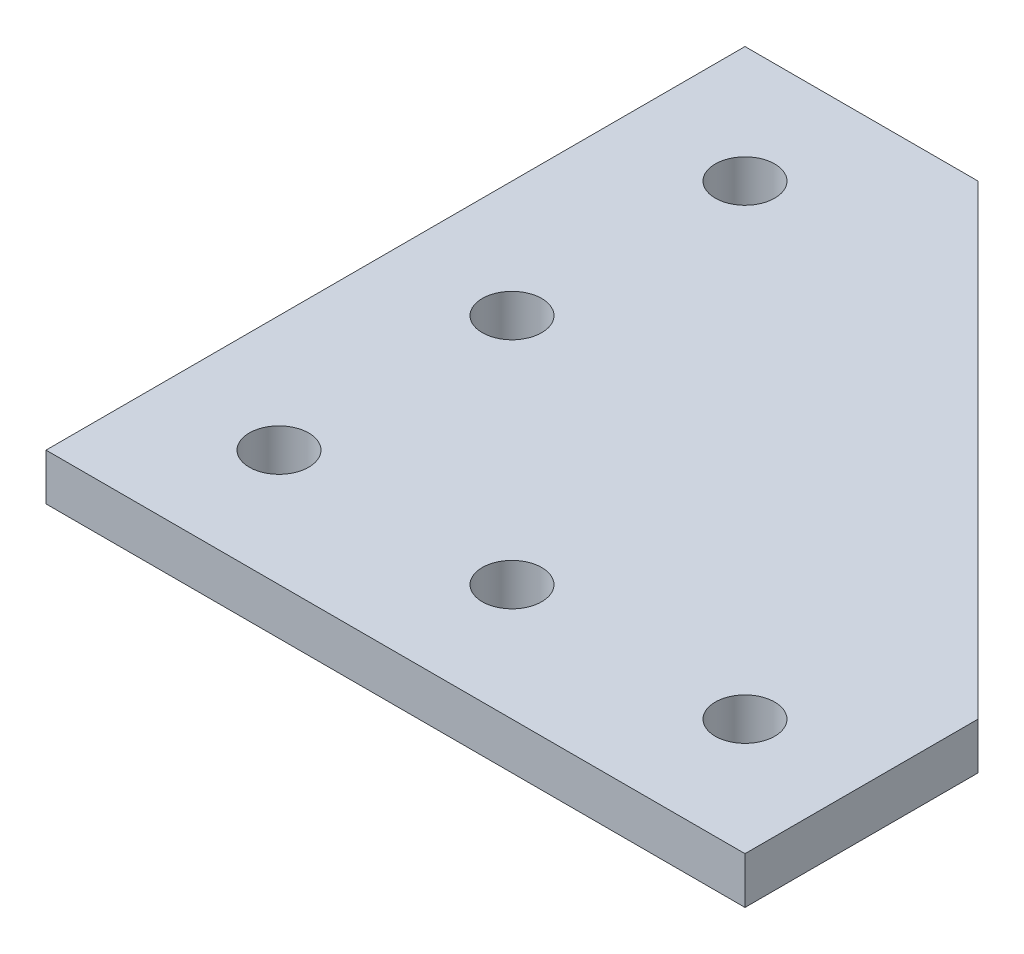
ISO-10303-21;
HEADER;
FILE_DESCRIPTION(('STEP AP214'),'2;1');
FILE_NAME('part.step','',(''),(''),'','','');
FILE_SCHEMA(('AUTOMOTIVE_DESIGN { 1 0 10303 214 1 1 1 1 }'));
ENDSEC;
DATA;
#1=APPLICATION_CONTEXT('core data for automotive mechanical design processes');
#2=APPLICATION_PROTOCOL_DEFINITION('international standard','automotive_design',2000,#1);
#3=PRODUCT_CONTEXT('',#1,'mechanical');
#4=PRODUCT('Part','Part','',(#3));
#5=PRODUCT_RELATED_PRODUCT_CATEGORY('part','',(#4));
#6=PRODUCT_DEFINITION_FORMATION('','',#4);
#7=PRODUCT_DEFINITION_CONTEXT('part definition',#1,'design');
#8=PRODUCT_DEFINITION('design','',#6,#7);
#9=PRODUCT_DEFINITION_SHAPE('','',#8);
#10=(LENGTH_UNIT() NAMED_UNIT(*) SI_UNIT(.MILLI.,.METRE.));
#11=(NAMED_UNIT(*) PLANE_ANGLE_UNIT() SI_UNIT($,.RADIAN.));
#12=(NAMED_UNIT(*) SI_UNIT($,.STERADIAN.) SOLID_ANGLE_UNIT());
#13=UNCERTAINTY_MEASURE_WITH_UNIT(LENGTH_MEASURE(1.E-05),#10,'distance_accuracy_value','');
#14=(GEOMETRIC_REPRESENTATION_CONTEXT(3) GLOBAL_UNCERTAINTY_ASSIGNED_CONTEXT((#13)) GLOBAL_UNIT_ASSIGNED_CONTEXT((#10,
#11,#12)) REPRESENTATION_CONTEXT('',''));
#15=CARTESIAN_POINT('',(0.,0.,0.));
#16=DIRECTION('',(0.,0.,1.));
#17=DIRECTION('',(1.,0.,0.));
#18=AXIS2_PLACEMENT_3D('',#15,#16,#17);
#19=CARTESIAN_POINT('',(0.,4.,0.));
#20=DIRECTION('',(0.,1.,0.));
#21=DIRECTION('',(0.,0.,1.));
#22=AXIS2_PLACEMENT_3D('',#19,#20,#21);
#23=PLANE('',#22);
#24=CARTESIAN_POINT('',(10.,4.,-50.));
#25=DIRECTION('',(0.,1.,0.));
#26=DIRECTION('',(0.,0.,1.));
#27=AXIS2_PLACEMENT_3D('',#24,#25,#26);
#28=CIRCLE('',#27,2.55);
#29=CARTESIAN_POINT('',(10.,4.,-47.45));
#30=VERTEX_POINT('',#29);
#31=EDGE_CURVE('E180',#30,#30,#28,.T.);
#32=ORIENTED_EDGE('',*,*,#31,.F.);
#33=EDGE_LOOP('',(#32));
#34=FACE_BOUND('',#33,.T.);
#35=CARTESIAN_POINT('',(30.,4.,-10.));
#36=DIRECTION('',(0.,1.,0.));
#37=DIRECTION('',(0.,0.,1.));
#38=AXIS2_PLACEMENT_3D('',#35,#36,#37);
#39=CIRCLE('',#38,2.55);
#40=CARTESIAN_POINT('',(30.,4.,-7.45));
#41=VERTEX_POINT('',#40);
#42=EDGE_CURVE('E192',#41,#41,#39,.T.);
#43=ORIENTED_EDGE('',*,*,#42,.F.);
#44=EDGE_LOOP('',(#43));
#45=FACE_BOUND('',#44,.T.);
#46=DIRECTION('',(0.,0.,1.));
#47=VECTOR('',#46,1.);
#48=CARTESIAN_POINT('',(0.,4.,-60.));
#49=LINE('',#48,#47);
#50=CARTESIAN_POINT('',(0.,4.,-60.));
#51=VERTEX_POINT('',#50);
#52=CARTESIAN_POINT('',(0.,4.,0.));
#53=VERTEX_POINT('',#52);
#54=EDGE_CURVE('E121',#51,#53,#49,.T.);
#55=ORIENTED_EDGE('',*,*,#54,.T.);
#56=DIRECTION('',(1.,0.,0.));
#57=VECTOR('',#56,1.);
#58=CARTESIAN_POINT('',(0.,4.,0.));
#59=LINE('',#58,#57);
#60=CARTESIAN_POINT('',(60.,4.,0.));
#61=VERTEX_POINT('',#60);
#62=EDGE_CURVE('E88',#53,#61,#59,.T.);
#63=ORIENTED_EDGE('',*,*,#62,.T.);
#64=DIRECTION('',(0.,0.,-1.));
#65=VECTOR('',#64,1.);
#66=CARTESIAN_POINT('',(60.,4.,0.));
#67=LINE('',#66,#65);
#68=CARTESIAN_POINT('',(60.,4.,-20.));
#69=VERTEX_POINT('',#68);
#70=EDGE_CURVE('E92',#61,#69,#67,.T.);
#71=ORIENTED_EDGE('',*,*,#70,.T.);
#72=DIRECTION('',(-0.707106781186548,0.,-0.707106781186548));
#73=VECTOR('',#72,1.);
#74=CARTESIAN_POINT('',(60.,4.,-20.));
#75=LINE('',#74,#73);
#76=CARTESIAN_POINT('',(20.,4.,-60.));
#77=VERTEX_POINT('',#76);
#78=EDGE_CURVE('E96',#69,#77,#75,.T.);
#79=ORIENTED_EDGE('',*,*,#78,.T.);
#80=DIRECTION('',(-1.,0.,0.));
#81=VECTOR('',#80,1.);
#82=CARTESIAN_POINT('',(20.,4.,-60.));
#83=LINE('',#82,#81);
#84=EDGE_CURVE('E54',#77,#51,#83,.T.);
#85=ORIENTED_EDGE('',*,*,#84,.T.);
#86=EDGE_LOOP('',(#55,#63,#71,#79,#85));
#87=FACE_BOUND('',#86,.T.);
#88=CARTESIAN_POINT('',(10.,4.,-10.));
#89=DIRECTION('',(0.,1.,0.));
#90=DIRECTION('',(0.,0.,1.));
#91=AXIS2_PLACEMENT_3D('',#88,#89,#90);
#92=CIRCLE('',#91,2.55);
#93=CARTESIAN_POINT('',(10.,4.,-7.45));
#94=VERTEX_POINT('',#93);
#95=EDGE_CURVE('E116',#94,#94,#92,.T.);
#96=ORIENTED_EDGE('',*,*,#95,.F.);
#97=EDGE_LOOP('',(#96));
#98=FACE_BOUND('',#97,.T.);
#99=CARTESIAN_POINT('',(50.,4.,-10.));
#100=DIRECTION('',(0.,1.,0.));
#101=DIRECTION('',(0.,0.,1.));
#102=AXIS2_PLACEMENT_3D('',#99,#100,#101);
#103=CIRCLE('',#102,2.55);
#104=CARTESIAN_POINT('',(50.,4.,-7.45));
#105=VERTEX_POINT('',#104);
#106=EDGE_CURVE('E186',#105,#105,#103,.T.);
#107=ORIENTED_EDGE('',*,*,#106,.F.);
#108=EDGE_LOOP('',(#107));
#109=FACE_BOUND('',#108,.T.);
#110=CARTESIAN_POINT('',(10.,4.,-30.));
#111=DIRECTION('',(0.,1.,0.));
#112=DIRECTION('',(0.,0.,1.));
#113=AXIS2_PLACEMENT_3D('',#110,#111,#112);
#114=CIRCLE('',#113,2.55);
#115=CARTESIAN_POINT('',(10.,4.,-27.45));
#116=VERTEX_POINT('',#115);
#117=EDGE_CURVE('E171',#116,#116,#114,.T.);
#118=ORIENTED_EDGE('',*,*,#117,.F.);
#119=EDGE_LOOP('',(#118));
#120=FACE_BOUND('',#119,.T.);
#121=ADVANCED_FACE('F37',(#34,#45,#87,#98,#109,#120),#23,.T.);
#122=CARTESIAN_POINT('',(0.,0.,0.));
#123=DIRECTION('',(0.,1.,0.));
#124=DIRECTION('',(0.,0.,1.));
#125=AXIS2_PLACEMENT_3D('',#122,#123,#124);
#126=PLANE('',#125);
#127=DIRECTION('',(0.,0.,1.));
#128=VECTOR('',#127,1.);
#129=CARTESIAN_POINT('',(0.,0.,-60.));
#130=LINE('',#129,#128);
#131=CARTESIAN_POINT('',(0.,0.,-60.));
#132=VERTEX_POINT('',#131);
#133=CARTESIAN_POINT('',(0.,0.,0.));
#134=VERTEX_POINT('',#133);
#135=EDGE_CURVE('E112',#132,#134,#130,.T.);
#136=ORIENTED_EDGE('',*,*,#135,.F.);
#137=DIRECTION('',(-1.,0.,0.));
#138=VECTOR('',#137,1.);
#139=CARTESIAN_POINT('',(20.,0.,-60.));
#140=LINE('',#139,#138);
#141=CARTESIAN_POINT('',(20.,0.,-60.));
#142=VERTEX_POINT('',#141);
#143=EDGE_CURVE('E80',#142,#132,#140,.T.);
#144=ORIENTED_EDGE('',*,*,#143,.F.);
#145=DIRECTION('',(-0.707106781186548,0.,-0.707106781186548));
#146=VECTOR('',#145,1.);
#147=CARTESIAN_POINT('',(60.,0.,-20.));
#148=LINE('',#147,#146);
#149=CARTESIAN_POINT('',(60.,0.,-20.));
#150=VERTEX_POINT('',#149);
#151=EDGE_CURVE('E74',#150,#142,#148,.T.);
#152=ORIENTED_EDGE('',*,*,#151,.F.);
#153=DIRECTION('',(0.,0.,-1.));
#154=VECTOR('',#153,1.);
#155=CARTESIAN_POINT('',(60.,0.,0.));
#156=LINE('',#155,#154);
#157=CARTESIAN_POINT('',(60.,0.,0.));
#158=VERTEX_POINT('',#157);
#159=EDGE_CURVE('E103',#158,#150,#156,.T.);
#160=ORIENTED_EDGE('',*,*,#159,.F.);
#161=DIRECTION('',(1.,0.,0.));
#162=VECTOR('',#161,1.);
#163=CARTESIAN_POINT('',(0.,0.,0.));
#164=LINE('',#163,#162);
#165=EDGE_CURVE('E115',#134,#158,#164,.T.);
#166=ORIENTED_EDGE('',*,*,#165,.F.);
#167=EDGE_LOOP('',(#136,#144,#152,#160,#166));
#168=FACE_BOUND('',#167,.T.);
#169=CARTESIAN_POINT('',(10.,0.,-10.));
#170=DIRECTION('',(0.,1.,0.));
#171=DIRECTION('',(0.,0.,1.));
#172=AXIS2_PLACEMENT_3D('',#169,#170,#171);
#173=CIRCLE('',#172,2.55);
#174=CARTESIAN_POINT('',(10.,0.,-7.45));
#175=VERTEX_POINT('',#174);
#176=EDGE_CURVE('E195',#175,#175,#173,.T.);
#177=ORIENTED_EDGE('',*,*,#176,.T.);
#178=EDGE_LOOP('',(#177));
#179=FACE_BOUND('',#178,.T.);
#180=CARTESIAN_POINT('',(30.,0.,-10.));
#181=DIRECTION('',(0.,1.,0.));
#182=DIRECTION('',(0.,0.,1.));
#183=AXIS2_PLACEMENT_3D('',#180,#181,#182);
#184=CIRCLE('',#183,2.55);
#185=CARTESIAN_POINT('',(30.,0.,-7.45));
#186=VERTEX_POINT('',#185);
#187=EDGE_CURVE('E189',#186,#186,#184,.T.);
#188=ORIENTED_EDGE('',*,*,#187,.T.);
#189=EDGE_LOOP('',(#188));
#190=FACE_BOUND('',#189,.T.);
#191=CARTESIAN_POINT('',(50.,0.,-10.));
#192=DIRECTION('',(0.,1.,0.));
#193=DIRECTION('',(0.,0.,1.));
#194=AXIS2_PLACEMENT_3D('',#191,#192,#193);
#195=CIRCLE('',#194,2.55);
#196=CARTESIAN_POINT('',(50.,0.,-7.45));
#197=VERTEX_POINT('',#196);
#198=EDGE_CURVE('E183',#197,#197,#195,.T.);
#199=ORIENTED_EDGE('',*,*,#198,.T.);
#200=EDGE_LOOP('',(#199));
#201=FACE_BOUND('',#200,.T.);
#202=CARTESIAN_POINT('',(10.,0.,-50.));
#203=DIRECTION('',(0.,1.,0.));
#204=DIRECTION('',(0.,0.,1.));
#205=AXIS2_PLACEMENT_3D('',#202,#203,#204);
#206=CIRCLE('',#205,2.55);
#207=CARTESIAN_POINT('',(10.,0.,-47.45));
#208=VERTEX_POINT('',#207);
#209=EDGE_CURVE('E177',#208,#208,#206,.T.);
#210=ORIENTED_EDGE('',*,*,#209,.T.);
#211=EDGE_LOOP('',(#210));
#212=FACE_BOUND('',#211,.T.);
#213=CARTESIAN_POINT('',(10.,0.,-30.));
#214=DIRECTION('',(0.,1.,0.));
#215=DIRECTION('',(0.,0.,1.));
#216=AXIS2_PLACEMENT_3D('',#213,#214,#215);
#217=CIRCLE('',#216,2.55);
#218=CARTESIAN_POINT('',(10.,0.,-27.45));
#219=VERTEX_POINT('',#218);
#220=EDGE_CURVE('E174',#219,#219,#217,.T.);
#221=ORIENTED_EDGE('',*,*,#220,.T.);
#222=EDGE_LOOP('',(#221));
#223=FACE_BOUND('',#222,.T.);
#224=ADVANCED_FACE('F125',(#168,#179,#190,#201,#212,#223),#126,.F.);
#225=CARTESIAN_POINT('',(0.,4.,-60.));
#226=DIRECTION('',(1.,0.,0.));
#227=DIRECTION('',(0.,0.,-1.));
#228=AXIS2_PLACEMENT_3D('',#225,#226,#227);
#229=PLANE('',#228);
#230=ORIENTED_EDGE('',*,*,#135,.T.);
#231=DIRECTION('',(0.,-1.,0.));
#232=VECTOR('',#231,1.);
#233=CARTESIAN_POINT('',(0.,4.,0.));
#234=LINE('',#233,#232);
#235=EDGE_CURVE('E11',#53,#134,#234,.T.);
#236=ORIENTED_EDGE('',*,*,#235,.F.);
#237=ORIENTED_EDGE('',*,*,#54,.F.);
#238=DIRECTION('',(0.,-1.,0.));
#239=VECTOR('',#238,1.);
#240=CARTESIAN_POINT('',(0.,4.,-60.));
#241=LINE('',#240,#239);
#242=EDGE_CURVE('E108',#51,#132,#241,.T.);
#243=ORIENTED_EDGE('',*,*,#242,.T.);
#244=EDGE_LOOP('',(#230,#236,#237,#243));
#245=FACE_BOUND('',#244,.T.);
#246=ADVANCED_FACE('F39',(#245),#229,.F.);
#247=CARTESIAN_POINT('',(0.,4.,0.));
#248=DIRECTION('',(0.,0.,-1.));
#249=DIRECTION('',(-1.,0.,0.));
#250=AXIS2_PLACEMENT_3D('',#247,#248,#249);
#251=PLANE('',#250);
#252=ORIENTED_EDGE('',*,*,#165,.T.);
#253=DIRECTION('',(0.,-1.,0.));
#254=VECTOR('',#253,1.);
#255=CARTESIAN_POINT('',(60.,4.,0.));
#256=LINE('',#255,#254);
#257=EDGE_CURVE('E46',#61,#158,#256,.T.);
#258=ORIENTED_EDGE('',*,*,#257,.F.);
#259=ORIENTED_EDGE('',*,*,#62,.F.);
#260=ORIENTED_EDGE('',*,*,#235,.T.);
#261=EDGE_LOOP('',(#252,#258,#259,#260));
#262=FACE_BOUND('',#261,.T.);
#263=ADVANCED_FACE('F247',(#262),#251,.F.);
#264=CARTESIAN_POINT('',(60.,4.,0.));
#265=DIRECTION('',(-1.,0.,0.));
#266=DIRECTION('',(0.,0.,1.));
#267=AXIS2_PLACEMENT_3D('',#264,#265,#266);
#268=PLANE('',#267);
#269=ORIENTED_EDGE('',*,*,#159,.T.);
#270=DIRECTION('',(0.,-1.,0.));
#271=VECTOR('',#270,1.);
#272=CARTESIAN_POINT('',(60.,4.,-20.));
#273=LINE('',#272,#271);
#274=EDGE_CURVE('E100',#69,#150,#273,.T.);
#275=ORIENTED_EDGE('',*,*,#274,.F.);
#276=ORIENTED_EDGE('',*,*,#70,.F.);
#277=ORIENTED_EDGE('',*,*,#257,.T.);
#278=EDGE_LOOP('',(#269,#275,#276,#277));
#279=FACE_BOUND('',#278,.T.);
#280=ADVANCED_FACE('F101',(#279),#268,.F.);
#281=CARTESIAN_POINT('',(60.,4.,-20.));
#282=DIRECTION('',(-0.707106781186547,0.,0.707106781186547));
#283=DIRECTION('',(0.707106781186548,0.,0.707106781186548));
#284=AXIS2_PLACEMENT_3D('',#281,#282,#283);
#285=PLANE('',#284);
#286=ORIENTED_EDGE('',*,*,#151,.T.);
#287=DIRECTION('',(0.,-1.,0.));
#288=VECTOR('',#287,1.);
#289=CARTESIAN_POINT('',(20.,4.,-60.));
#290=LINE('',#289,#288);
#291=EDGE_CURVE('E104',#77,#142,#290,.T.);
#292=ORIENTED_EDGE('',*,*,#291,.F.);
#293=ORIENTED_EDGE('',*,*,#78,.F.);
#294=ORIENTED_EDGE('',*,*,#274,.T.);
#295=EDGE_LOOP('',(#286,#292,#293,#294));
#296=FACE_BOUND('',#295,.T.);
#297=ADVANCED_FACE('F106',(#296),#285,.F.);
#298=CARTESIAN_POINT('',(20.,4.,-60.));
#299=DIRECTION('',(0.,0.,1.));
#300=DIRECTION('',(1.,0.,0.));
#301=AXIS2_PLACEMENT_3D('',#298,#299,#300);
#302=PLANE('',#301);
#303=ORIENTED_EDGE('',*,*,#143,.T.);
#304=ORIENTED_EDGE('',*,*,#242,.F.);
#305=ORIENTED_EDGE('',*,*,#84,.F.);
#306=ORIENTED_EDGE('',*,*,#291,.T.);
#307=EDGE_LOOP('',(#303,#304,#305,#306));
#308=FACE_BOUND('',#307,.T.);
#309=ADVANCED_FACE('F130',(#308),#302,.F.);
#310=CARTESIAN_POINT('',(10.,4.,-10.));
#311=DIRECTION('',(0.,-1.,0.));
#312=DIRECTION('',(0.,0.,-1.));
#313=AXIS2_PLACEMENT_3D('',#310,#311,#312);
#314=CYLINDRICAL_SURFACE('',#313,2.55);
#315=ORIENTED_EDGE('',*,*,#95,.T.);
#316=EDGE_LOOP('',(#315));
#317=FACE_BOUND('',#316,.T.);
#318=ORIENTED_EDGE('',*,*,#176,.F.);
#319=EDGE_LOOP('',(#318));
#320=FACE_BOUND('',#319,.T.);
#321=ADVANCED_FACE('F132',(#317,#320),#314,.F.);
#322=CARTESIAN_POINT('',(30.,4.,-10.));
#323=DIRECTION('',(0.,-1.,0.));
#324=DIRECTION('',(0.,0.,-1.));
#325=AXIS2_PLACEMENT_3D('',#322,#323,#324);
#326=CYLINDRICAL_SURFACE('',#325,2.55);
#327=ORIENTED_EDGE('',*,*,#42,.T.);
#328=EDGE_LOOP('',(#327));
#329=FACE_BOUND('',#328,.T.);
#330=ORIENTED_EDGE('',*,*,#187,.F.);
#331=EDGE_LOOP('',(#330));
#332=FACE_BOUND('',#331,.T.);
#333=ADVANCED_FACE('F138',(#329,#332),#326,.F.);
#334=CARTESIAN_POINT('',(50.,4.,-10.));
#335=DIRECTION('',(0.,-1.,0.));
#336=DIRECTION('',(0.,0.,-1.));
#337=AXIS2_PLACEMENT_3D('',#334,#335,#336);
#338=CYLINDRICAL_SURFACE('',#337,2.55);
#339=ORIENTED_EDGE('',*,*,#106,.T.);
#340=EDGE_LOOP('',(#339));
#341=FACE_BOUND('',#340,.T.);
#342=ORIENTED_EDGE('',*,*,#198,.F.);
#343=EDGE_LOOP('',(#342));
#344=FACE_BOUND('',#343,.T.);
#345=ADVANCED_FACE('F154',(#341,#344),#338,.F.);
#346=CARTESIAN_POINT('',(10.,4.,-50.));
#347=DIRECTION('',(0.,-1.,0.));
#348=DIRECTION('',(0.,0.,-1.));
#349=AXIS2_PLACEMENT_3D('',#346,#347,#348);
#350=CYLINDRICAL_SURFACE('',#349,2.55);
#351=ORIENTED_EDGE('',*,*,#31,.T.);
#352=EDGE_LOOP('',(#351));
#353=FACE_BOUND('',#352,.T.);
#354=ORIENTED_EDGE('',*,*,#209,.F.);
#355=EDGE_LOOP('',(#354));
#356=FACE_BOUND('',#355,.T.);
#357=ADVANCED_FACE('F158',(#353,#356),#350,.F.);
#358=CARTESIAN_POINT('',(10.,4.,-30.));
#359=DIRECTION('',(0.,-1.,0.));
#360=DIRECTION('',(0.,0.,-1.));
#361=AXIS2_PLACEMENT_3D('',#358,#359,#360);
#362=CYLINDRICAL_SURFACE('',#361,2.55);
#363=ORIENTED_EDGE('',*,*,#117,.T.);
#364=EDGE_LOOP('',(#363));
#365=FACE_BOUND('',#364,.T.);
#366=ORIENTED_EDGE('',*,*,#220,.F.);
#367=EDGE_LOOP('',(#366));
#368=FACE_BOUND('',#367,.T.);
#369=ADVANCED_FACE('F162',(#365,#368),#362,.F.);
#370=CLOSED_SHELL('',(#121,#224,#246,#263,#280,#297,#309,#321,#333,#345,#357,#369));
#371=MANIFOLD_SOLID_BREP('B2',#370);
#372=ADVANCED_BREP_SHAPE_REPRESENTATION('',(#18,#371),#14);
#373=SHAPE_DEFINITION_REPRESENTATION(#9,#372);
ENDSEC;
END-ISO-10303-21;
